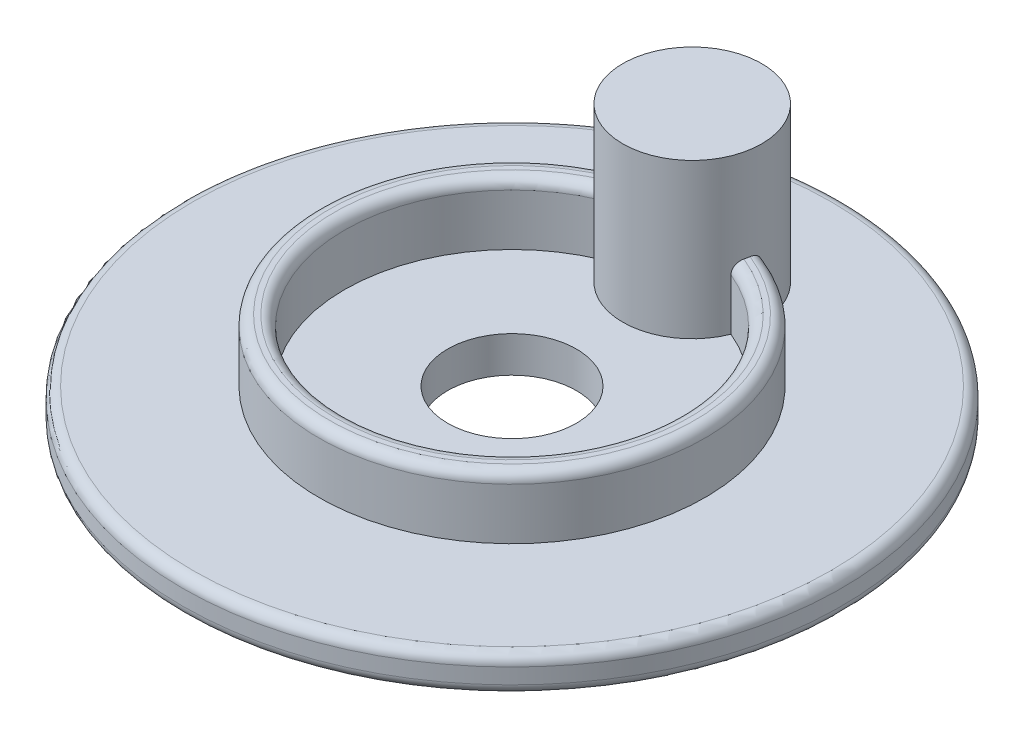
ISO-10303-21;
HEADER;
FILE_DESCRIPTION(('STEP AP214'),'2;1');
FILE_NAME('part.step','',(''),(''),'','','');
FILE_SCHEMA(('AUTOMOTIVE_DESIGN { 1 0 10303 214 1 1 1 1 }'));
ENDSEC;
DATA;
#1=APPLICATION_CONTEXT('core data for automotive mechanical design processes');
#2=APPLICATION_PROTOCOL_DEFINITION('international standard','automotive_design',2000,#1);
#3=PRODUCT_CONTEXT('',#1,'mechanical');
#4=PRODUCT('Part','Part','',(#3));
#5=PRODUCT_RELATED_PRODUCT_CATEGORY('part','',(#4));
#6=PRODUCT_DEFINITION_FORMATION('','',#4);
#7=PRODUCT_DEFINITION_CONTEXT('part definition',#1,'design');
#8=PRODUCT_DEFINITION('design','',#6,#7);
#9=PRODUCT_DEFINITION_SHAPE('','',#8);
#10=(LENGTH_UNIT() NAMED_UNIT(*) SI_UNIT(.MILLI.,.METRE.));
#11=(NAMED_UNIT(*) PLANE_ANGLE_UNIT() SI_UNIT($,.RADIAN.));
#12=(NAMED_UNIT(*) SI_UNIT($,.STERADIAN.) SOLID_ANGLE_UNIT());
#13=UNCERTAINTY_MEASURE_WITH_UNIT(LENGTH_MEASURE(1.E-05),#10,'distance_accuracy_value','');
#14=(GEOMETRIC_REPRESENTATION_CONTEXT(3) GLOBAL_UNCERTAINTY_ASSIGNED_CONTEXT((#13)) GLOBAL_UNIT_ASSIGNED_CONTEXT((#10,
#11,#12)) REPRESENTATION_CONTEXT('',''));
#15=CARTESIAN_POINT('',(0.,0.,0.));
#16=DIRECTION('',(0.,0.,1.));
#17=DIRECTION('',(1.,0.,0.));
#18=AXIS2_PLACEMENT_3D('',#15,#16,#17);
#19=CARTESIAN_POINT('',(0.,19.,0.));
#20=DIRECTION('',(0.,-1.,0.));
#21=DIRECTION('',(0.,0.,-1.));
#22=AXIS2_PLACEMENT_3D('',#19,#20,#21);
#23=CYLINDRICAL_SURFACE('',#22,37.5);
#24=DIRECTION('',(0.,-1.,0.));
#25=VECTOR('',#24,1.);
#26=CARTESIAN_POINT('',(13.4999924414189,22.,-34.9857142857143));
#27=LINE('',#26,#25);
#28=CARTESIAN_POINT('',(13.4999924414189,17.,-34.9857142857143));
#29=VERTEX_POINT('',#28);
#30=CARTESIAN_POINT('',(13.4999924414189,7.,-34.9857142857143));
#31=VERTEX_POINT('',#30);
#32=EDGE_CURVE('E205',#29,#31,#27,.T.);
#33=ORIENTED_EDGE('',*,*,#32,.F.);
#34=CARTESIAN_POINT('',(0.,17.,0.));
#35=DIRECTION('',(0.,1.,0.));
#36=DIRECTION('',(0.,0.,1.));
#37=AXIS2_PLACEMENT_3D('',#34,#35,#36);
#38=CIRCLE('',#37,37.5);
#39=CARTESIAN_POINT('',(-13.4999924414189,17.,-34.9857142857143));
#40=VERTEX_POINT('',#39);
#41=EDGE_CURVE('E159',#29,#40,#38,.F.);
#42=ORIENTED_EDGE('',*,*,#41,.T.);
#43=DIRECTION('',(0.,-1.,0.));
#44=VECTOR('',#43,1.);
#45=CARTESIAN_POINT('',(-13.4999924414189,22.,-34.9857142857143));
#46=LINE('',#45,#44);
#47=CARTESIAN_POINT('',(-13.4999924414189,7.,-34.9857142857143));
#48=VERTEX_POINT('',#47);
#49=EDGE_CURVE('E67',#48,#40,#46,.F.);
#50=ORIENTED_EDGE('',*,*,#49,.F.);
#51=CARTESIAN_POINT('',(0.,7.,0.));
#52=DIRECTION('',(0.,1.,0.));
#53=DIRECTION('',(0.,0.,1.));
#54=AXIS2_PLACEMENT_3D('',#51,#52,#53);
#55=CIRCLE('',#54,37.5);
#56=EDGE_CURVE('E126',#48,#31,#55,.T.);
#57=ORIENTED_EDGE('',*,*,#56,.T.);
#58=EDGE_LOOP('',(#33,#42,#50,#57));
#59=FACE_BOUND('',#58,.T.);
#60=ADVANCED_FACE('F45',(#59),#23,.T.);
#61=CARTESIAN_POINT('',(0.,19.,0.));
#62=DIRECTION('',(0.,-1.,0.));
#63=DIRECTION('',(0.,0.,-1.));
#64=AXIS2_PLACEMENT_3D('',#61,#62,#63);
#65=CYLINDRICAL_SURFACE('',#64,32.5);
#66=CARTESIAN_POINT('',(0.,17.,0.));
#67=DIRECTION('',(0.,1.,0.));
#68=DIRECTION('',(0.,0.,1.));
#69=AXIS2_PLACEMENT_3D('',#66,#67,#68);
#70=CIRCLE('',#69,32.5);
#71=CARTESIAN_POINT('',(-12.5342306814383,17.,-29.9857142857143));
#72=VERTEX_POINT('',#71);
#73=CARTESIAN_POINT('',(12.5342306814383,17.,-29.9857142857143));
#74=VERTEX_POINT('',#73);
#75=EDGE_CURVE('E118',#72,#74,#70,.T.);
#76=ORIENTED_EDGE('',*,*,#75,.T.);
#77=DIRECTION('',(0.,-1.,0.));
#78=VECTOR('',#77,1.);
#79=CARTESIAN_POINT('',(12.5342306814383,22.,-29.9857142857143));
#80=LINE('',#79,#78);
#81=CARTESIAN_POINT('',(12.5342306814383,7.,-29.9857142857143));
#82=VERTEX_POINT('',#81);
#83=EDGE_CURVE('E74',#74,#82,#80,.T.);
#84=ORIENTED_EDGE('',*,*,#83,.T.);
#85=CARTESIAN_POINT('',(0.,7.,0.));
#86=DIRECTION('',(0.,1.,0.));
#87=DIRECTION('',(0.,0.,1.));
#88=AXIS2_PLACEMENT_3D('',#85,#86,#87);
#89=CIRCLE('',#88,32.5);
#90=CARTESIAN_POINT('',(-12.5342306814383,7.,-29.9857142857143));
#91=VERTEX_POINT('',#90);
#92=EDGE_CURVE('E116',#82,#91,#89,.F.);
#93=ORIENTED_EDGE('',*,*,#92,.T.);
#94=DIRECTION('',(0.,-1.,0.));
#95=VECTOR('',#94,1.);
#96=CARTESIAN_POINT('',(-12.5342306814383,22.,-29.9857142857143));
#97=LINE('',#96,#95);
#98=EDGE_CURVE('E106',#91,#72,#97,.F.);
#99=ORIENTED_EDGE('',*,*,#98,.T.);
#100=EDGE_LOOP('',(#76,#84,#93,#99));
#101=FACE_BOUND('',#100,.T.);
#102=ADVANCED_FACE('F115',(#101),#65,.F.);
#103=CARTESIAN_POINT('',(0.,17.,0.));
#104=DIRECTION('',(0.,1.,0.));
#105=DIRECTION('',(0.,0.,1.));
#106=AXIS2_PLACEMENT_3D('',#103,#104,#105);
#107=TOROIDAL_SURFACE('',#106,34.5,2.);
#108=CARTESIAN_POINT('',(0.,19.,0.));
#109=DIRECTION('',(0.,1.,0.));
#110=DIRECTION('',(0.,0.,1.));
#111=AXIS2_PLACEMENT_3D('',#108,#109,#110);
#112=CIRCLE('',#111,34.5);
#113=CARTESIAN_POINT('',(13.1392541645255,19.,-31.9));
#114=VERTEX_POINT('',#113);
#115=CARTESIAN_POINT('',(-13.1392541645255,19.,-31.9));
#116=VERTEX_POINT('',#115);
#117=EDGE_CURVE('E155',#114,#116,#112,.F.);
#118=ORIENTED_EDGE('',*,*,#117,.F.);
#119=CARTESIAN_POINT('',(13.4574158289762,16.9998,-33.9285714181429));
#120=CARTESIAN_POINT('',(13.4574144173344,17.0545056757267,-33.928578843322));
#121=CARTESIAN_POINT('',(13.4572304603151,17.1091844471926,-33.9262404796411));
#122=CARTESIAN_POINT('',(13.4564838598886,17.218131998119,-33.9169142550499));
#123=CARTESIAN_POINT('',(13.4559212822476,17.2724008471276,-33.909927201617));
#124=CARTESIAN_POINT('',(13.4536498283262,17.4337539396021,-33.8821122901966));
#125=CARTESIAN_POINT('',(13.4513573831885,17.5397269979853,-33.8544301241502));
#126=CARTESIAN_POINT('',(13.4449784553747,17.7454532895092,-33.7818612507831));
#127=CARTESIAN_POINT('',(13.4408922087323,17.8452073389934,-33.7369768070862));
#128=CARTESIAN_POINT('',(13.4305739973357,18.0360152113749,-33.6316159779949));
#129=CARTESIAN_POINT('',(13.4243414211031,18.1270665454586,-33.571135150505));
#130=CARTESIAN_POINT('',(13.4091580731518,18.3002378827599,-33.434986634043));
#131=CARTESIAN_POINT('',(13.4001470188815,18.3820985500734,-33.358996233747));
#132=CARTESIAN_POINT('',(13.3790574540853,18.5324223858058,-33.195106525718));
#133=CARTESIAN_POINT('',(13.3669781511551,18.6008820851978,-33.1072041443426));
#134=CARTESIAN_POINT('',(13.3389501789862,18.7249333065295,-32.9187045171992));
#135=CARTESIAN_POINT('',(13.3228792968959,18.7799813003279,-32.8177672257079));
#136=CARTESIAN_POINT('',(13.2869546411496,18.8724741931693,-32.6087507538406));
#137=CARTESIAN_POINT('',(13.2671007797468,18.9099186838267,-32.5006714078416));
#138=CARTESIAN_POINT('',(13.2235226881637,18.9663246851704,-32.27947523551));
#139=CARTESIAN_POINT('',(13.199765923008,18.9851205740949,-32.1663224372503));
#140=CARTESIAN_POINT('',(13.148955175443,19.0029067051528,-31.9391973925251));
#141=CARTESIAN_POINT('',(13.1219014478561,19.0018984769831,-31.8252252100297));
#142=CARTESIAN_POINT('',(13.0657951446087,18.9800619834496,-31.6017579153184));
#143=CARTESIAN_POINT('',(13.0367840589503,18.9595688464566,-31.4922196959342));
#144=CARTESIAN_POINT('',(12.9774833344311,18.8996437962992,-31.2788182771367));
#145=CARTESIAN_POINT('',(12.9471938470116,18.860214120672,-31.1749544088578));
#146=CARTESIAN_POINT('',(12.8872987906026,18.7643786442,-30.9778171956945));
#147=CARTESIAN_POINT('',(12.8576912505481,18.7083130983703,-30.8843788804021));
#148=CARTESIAN_POINT('',(12.8000270425148,18.5804967058315,-30.7083925629165));
#149=CARTESIAN_POINT('',(12.7719702647317,18.5087469714537,-30.6258437890961));
#150=CARTESIAN_POINT('',(12.7190529410507,18.3520954903509,-30.4742834044056));
#151=CARTESIAN_POINT('',(12.6941733633002,18.2672794943705,-30.4051897454779));
#152=CARTESIAN_POINT('',(12.6487563939327,18.0865340347076,-30.2815985996307));
#153=CARTESIAN_POINT('',(12.6282201963043,17.9906015263017,-30.2271051251847));
#154=CARTESIAN_POINT('',(12.5926014063199,17.7900514594601,-30.133903341536));
#155=CARTESIAN_POINT('',(12.5775365423574,17.6854069950348,-30.0952462951689));
#156=CARTESIAN_POINT('',(12.5538444995709,17.4707146581686,-30.0349164781093));
#157=CARTESIAN_POINT('',(12.5452089055412,17.3606740505973,-30.0132215040611));
#158=CARTESIAN_POINT('',(12.5380973871844,17.2081290268839,-29.9953891622806));
#159=CARTESIAN_POINT('',(12.5366460719681,17.1665205228256,-29.9917556546748));
#160=CARTESIAN_POINT('',(12.534713044891,17.0832139548519,-29.9869194799736));
#161=CARTESIAN_POINT('',(12.5342296203805,17.0415161800581,-29.98571251917));
#162=CARTESIAN_POINT('',(12.5342306851531,16.9998,-29.985714295));
#163=B_SPLINE_CURVE_WITH_KNOTS('',3,(#119,#120,#121,#122,#123,#124,#125,#126,#127,#128,#129,
#130,#131,#132,#133,#134,#135,#136,#137,#138,#139,#140,#141,#142,#143,#144,#145,#146,#147,#148,
#149,#150,#151,#152,#153,#154,#155,#156,#157,#158,#159,#160,#161,#162),.UNSPECIFIED.,.F.,.F.,(4,
2,2,2,2,2,2,2,2,2,2,2,2,2,2,2,2,2,2,2,2,4),(0.,0.164013114976911,0.327997748307102,
0.654953654600703,0.98186655198686,1.30887266234879,1.64354277639147,1.97829941020852,
2.32494805147729,2.67160473428877,3.02131329684437,3.37099484753967,3.71476886214648,
4.05850226648402,4.39564011551689,4.73275406229653,5.06774310429607,5.40282411493564,
5.7389813783424,6.07469787165953,6.20001093474513,6.32510206394407),.UNSPECIFIED.);
#164=EDGE_CURVE('E121',#114,#74,#163,.T.);
#165=ORIENTED_EDGE('',*,*,#164,.T.);
#166=ORIENTED_EDGE('',*,*,#75,.F.);
#167=CARTESIAN_POINT('',(-12.5342306851531,16.9998,-29.985714295));
#168=CARTESIAN_POINT('',(-12.5342268697503,17.0560370969131,-29.9857102014814));
#169=CARTESIAN_POINT('',(-12.5351083889939,17.112247504364,-29.9879076817219));
#170=CARTESIAN_POINT('',(-12.5386171632372,17.2242670653584,-29.9966898332425));
#171=CARTESIAN_POINT('',(-12.5412443393752,17.2800762369129,-30.0032743063356));
#172=CARTESIAN_POINT('',(-12.5516963952655,17.4462179749447,-30.0295577193439));
#173=CARTESIAN_POINT('',(-12.5620919513565,17.5554391168735,-30.0557867580812));
#174=CARTESIAN_POINT('',(-12.5891352216796,17.7675921308088,-30.125059934522));
#175=CARTESIAN_POINT('',(-12.6057859806872,17.8705209115369,-30.1681122615214));
#176=CARTESIAN_POINT('',(-12.6443687816386,18.0671541834741,-30.270000660939));
#177=CARTESIAN_POINT('',(-12.6662996704453,18.1608606824676,-30.3288332873889));
#178=CARTESIAN_POINT('',(-12.71417539284,18.3362806307703,-30.4607657656329));
#179=CARTESIAN_POINT('',(-12.7401156037068,18.4180076834803,-30.533849211402));
#180=CARTESIAN_POINT('',(-12.7946190182422,18.5672854145666,-30.6924783656644));
#181=CARTESIAN_POINT('',(-12.8231825229434,18.6348344630349,-30.7780255050751));
#182=CARTESIAN_POINT('',(-12.8813541023824,18.7536392468189,-30.9589970000832));
#183=CARTESIAN_POINT('',(-12.9109582246778,18.8049505009224,-31.0543861877352));
#184=CARTESIAN_POINT('',(-12.9699017117889,18.8902257582849,-31.2526892087434));
#185=CARTESIAN_POINT('',(-12.9992410969053,18.9241911029708,-31.3556024595304));
#186=CARTESIAN_POINT('',(-13.0564582511928,18.9739983135213,-31.5662246489553));
#187=CARTESIAN_POINT('',(-13.0843345102258,18.9898217924573,-31.673938338251));
#188=CARTESIAN_POINT('',(-13.1376245140699,19.003044226538,-31.8910896393815));
#189=CARTESIAN_POINT('',(-13.1630380273819,19.0004414513077,-32.0005274121589));
#190=CARTESIAN_POINT('',(-13.2110676270142,18.9769229859204,-32.219632337999));
#191=CARTESIAN_POINT('',(-13.2336403826622,18.955755665444,-32.3292819056834));
#192=CARTESIAN_POINT('',(-13.2752139476901,18.8955084731271,-32.5442532211605));
#193=CARTESIAN_POINT('',(-13.2942142818322,18.8564262204455,-32.6495743916944));
#194=CARTESIAN_POINT('',(-13.3289403736964,18.7604541276025,-32.8551346096964));
#195=CARTESIAN_POINT('',(-13.3445886847945,18.7032063677102,-32.955219782195));
#196=CARTESIAN_POINT('',(-13.3722800261321,18.5727080043764,-33.1449178755092));
#197=CARTESIAN_POINT('',(-13.3843228762751,18.4994566018528,-33.234530273063));
#198=CARTESIAN_POINT('',(-13.4052345081904,18.33832263572,-33.4010060902396));
#199=CARTESIAN_POINT('',(-13.414083447063,18.2503534113501,-33.477788269201));
#200=CARTESIAN_POINT('',(-13.4289759312037,18.0623815166404,-33.6152952852834));
#201=CARTESIAN_POINT('',(-13.4350190162139,17.962376875458,-33.6760174873054));
#202=CARTESIAN_POINT('',(-13.4446552025307,17.7557533375156,-33.7777863466095));
#203=CARTESIAN_POINT('',(-13.4483045398741,17.6493556567674,-33.819277356271));
#204=CARTESIAN_POINT('',(-13.4537482819707,17.430997184884,-33.8829946601765));
#205=CARTESIAN_POINT('',(-13.455546165058,17.3190472412716,-33.9052570665295));
#206=CARTESIAN_POINT('',(-13.456824590558,17.1718751733412,-33.9211695182661));
#207=CARTESIAN_POINT('',(-13.4570470543442,17.1374912362917,-33.9239491880648));
#208=CARTESIAN_POINT('',(-13.4573426123094,17.0686765089656,-33.9276493397925));
#209=CARTESIAN_POINT('',(-13.4574159386702,17.0342458751527,-33.9285727116391));
#210=CARTESIAN_POINT('',(-13.4574158289763,16.9998,-33.9285714181432));
#211=B_SPLINE_CURVE_WITH_KNOTS('',3,(#167,#168,#169,#170,#171,#172,#173,#174,#175,#176,#177,
#178,#179,#180,#181,#182,#183,#184,#185,#186,#187,#188,#189,#190,#191,#192,#193,#194,#195,#196,
#197,#198,#199,#200,#201,#202,#203,#204,#205,#206,#207,#208,#209,#210),.UNSPECIFIED.,.F.,.F.,(4,
2,2,2,2,2,2,2,2,2,2,2,2,2,2,2,2,2,2,2,2,4),(0.,0.168607732966097,0.337207849425625,
0.673891678436985,1.01073960408894,1.34751403154103,1.68390301780707,2.02033065430595,
2.35559525892231,2.6908339322903,3.02641207326334,3.36202172817174,3.70225190011525,
4.04252730075171,4.3899736564934,4.73743736463633,5.08702405062106,5.43666806077358,
5.77777195553727,6.11823384149522,6.221689479048,6.32498392991242),.UNSPECIFIED.);
#212=EDGE_CURVE('E180',#72,#116,#211,.T.);
#213=ORIENTED_EDGE('',*,*,#212,.T.);
#214=EDGE_LOOP('',(#118,#165,#166,#213));
#215=FACE_BOUND('',#214,.T.);
#216=ADVANCED_FACE('F192',(#215),#107,.T.);
#217=CARTESIAN_POINT('',(0.,17.,0.));
#218=DIRECTION('',(0.,1.,0.));
#219=DIRECTION('',(0.,0.,1.));
#220=AXIS2_PLACEMENT_3D('',#217,#218,#219);
#221=TOROIDAL_SURFACE('',#220,35.5,2.);
#222=ORIENTED_EDGE('',*,*,#41,.F.);
#223=CARTESIAN_POINT('',(13.4999924414076,16.9998,-34.985714275));
#224=CARTESIAN_POINT('',(13.4999899547307,17.0536329745252,-34.9857287238921));
#225=CARTESIAN_POINT('',(13.4999899276816,17.1074619317858,-34.9833972496276));
#226=CARTESIAN_POINT('',(13.4999766332635,17.2147073111454,-34.9741090601479));
#227=CARTESIAN_POINT('',(13.4999633689337,17.2681238250999,-34.9671534067124));
#228=CARTESIAN_POINT('',(13.499905538721,17.3740132564129,-34.9487098217433));
#229=CARTESIAN_POINT('',(13.4998610624664,17.4264884354747,-34.937234909009));
#230=CARTESIAN_POINT('',(13.4997061356343,17.5302664603213,-34.909888940599));
#231=CARTESIAN_POINT('',(13.4995956834144,17.5815692768869,-34.8940177754833));
#232=CARTESIAN_POINT('',(13.4991009478815,17.7331455080814,-34.8400511133429));
#233=CARTESIAN_POINT('',(13.4985534243507,17.8312261073027,-34.7955777571894));
#234=CARTESIAN_POINT('',(13.496571460751,18.018849826176,-34.6913604325385));
#235=CARTESIAN_POINT('',(13.495136596677,18.1083888407102,-34.631609171687));
#236=CARTESIAN_POINT('',(13.4907851678145,18.2798138791902,-34.4965933977191));
#237=CARTESIAN_POINT('',(13.487820341785,18.361340728843,-34.4208742995195));
#238=CARTESIAN_POINT('',(13.4798195699396,18.5114209090165,-34.2576123285346));
#239=CARTESIAN_POINT('',(13.4747829919531,18.5799702702788,-34.1700658522452));
#240=CARTESIAN_POINT('',(13.461787763825,18.7061809248193,-33.9802904275848));
#241=CARTESIAN_POINT('',(13.4536786481031,18.7629967187266,-33.8775084744869));
#242=CARTESIAN_POINT('',(13.434191708356,18.8591602094536,-33.664356522181));
#243=CARTESIAN_POINT('',(13.4228134558381,18.8985056146712,-33.5539855297053));
#244=CARTESIAN_POINT('',(13.3963056625503,18.9593530414738,-33.3259413135855));
#245=CARTESIAN_POINT('',(13.3810921218905,18.980400937157,-33.2081560858591));
#246=CARTESIAN_POINT('',(13.347220150079,19.0021669054666,-32.971199584585));
#247=CARTESIAN_POINT('',(13.3285619207529,19.0028861687747,-32.8520283926245));
#248=CARTESIAN_POINT('',(13.2886712580937,18.9837814867689,-32.6177506991559));
#249=CARTESIAN_POINT('',(13.2674849557477,18.9642871303243,-32.5026096575149));
#250=CARTESIAN_POINT('',(13.2232074306106,18.9054833668645,-32.2778868322746));
#251=CARTESIAN_POINT('',(13.2001165658804,18.8661776773439,-32.1683040099483));
#252=CARTESIAN_POINT('',(13.1539706322896,18.7701503779794,-31.9612532947442));
#253=CARTESIAN_POINT('',(13.1309357892816,18.7139941660639,-31.8635184821903));
#254=CARTESIAN_POINT('',(13.0855537030355,18.5853813846498,-31.6792624018784));
#255=CARTESIAN_POINT('',(13.0632063616116,18.5129271551624,-31.5927395271582));
#256=CARTESIAN_POINT('',(13.021011075757,18.3553202712599,-31.4349149209358));
#257=CARTESIAN_POINT('',(13.001123090462,18.2704408857248,-31.3633507303774));
#258=CARTESIAN_POINT('',(12.9646110233555,18.0893501575886,-31.2352539998953));
#259=CARTESIAN_POINT('',(12.9479876844063,17.993136243793,-31.1787248801307));
#260=CARTESIAN_POINT('',(12.9191651259513,17.7926024562649,-31.0823859589683));
#261=CARTESIAN_POINT('',(12.9069472904254,17.688319007875,-31.0425056901417));
#262=CARTESIAN_POINT('',(12.8876599780105,17.4742977638884,-30.9801366129713));
#263=CARTESIAN_POINT('',(12.8805838414646,17.3645672211266,-30.9576253055681));
#264=CARTESIAN_POINT('',(12.8746783416316,17.2116227676772,-30.9388825083058));
#265=CARTESIAN_POINT('',(12.8734558295233,17.1693203162385,-30.9350102083425));
#266=CARTESIAN_POINT('',(12.871827208792,17.0846180119705,-30.9298560310052));
#267=CARTESIAN_POINT('',(12.8714196463463,17.0422184679216,-30.9285695406765));
#268=CARTESIAN_POINT('',(12.8714206467543,16.9998,-30.9285714381429));
#269=B_SPLINE_CURVE_WITH_KNOTS('',3,(#223,#224,#225,#226,#227,#228,#229,#230,#231,#232,#233,
#234,#235,#236,#237,#238,#239,#240,#241,#242,#243,#244,#245,#246,#247,#248,#249,#250,#251,#252,
#253,#254,#255,#256,#257,#258,#259,#260,#261,#262,#263,#264,#265,#266,#267,#268),.UNSPECIFIED.,
.F.,.F.,(4,2,2,2,2,2,2,2,2,2,2,2,2,2,2,2,2,2,2,2,2,2,4),(0.,0.161440946562061,0.322844836699355,
0.4837871262088,0.644733422571578,0.966206653779078,1.28783361596148,1.62028953473868,
1.95284697385498,2.30439862484178,2.65599637547557,3.01608986065854,3.37616225452467,
3.73045450987586,4.08468030884758,4.4281442754682,4.77155896019543,5.10831913809362,
5.44515585638527,5.78055206976081,6.11551309145407,6.24293635038863,6.37013209013873),.UNSPECIFIED.);
#270=CARTESIAN_POINT('',(13.3356664625358,19.0000000000003,-32.9));
#271=VERTEX_POINT('',#270);
#272=EDGE_CURVE('E11',#29,#271,#269,.T.);
#273=ORIENTED_EDGE('',*,*,#272,.T.);
#274=CARTESIAN_POINT('',(0.,19.,0.));
#275=DIRECTION('',(0.,1.,0.));
#276=DIRECTION('',(0.,0.,1.));
#277=AXIS2_PLACEMENT_3D('',#274,#275,#276);
#278=CIRCLE('',#277,35.5);
#279=CARTESIAN_POINT('',(-13.3356664625357,19.,-32.9));
#280=VERTEX_POINT('',#279);
#281=EDGE_CURVE('E151',#280,#271,#278,.T.);
#282=ORIENTED_EDGE('',*,*,#281,.F.);
#283=CARTESIAN_POINT('',(-12.8714206467543,16.9998,-30.9285714381429));
#284=CARTESIAN_POINT('',(-12.8714171743057,17.0558214967457,-30.9285671117731));
#285=CARTESIAN_POINT('',(-12.8721305543787,17.1118164220704,-30.9308149912982));
#286=CARTESIAN_POINT('',(-12.8749675988924,17.2234066950352,-30.939797781384));
#287=CARTESIAN_POINT('',(-12.8770912019435,17.2790020599623,-30.9465324966247));
#288=CARTESIAN_POINT('',(-12.8855335680313,17.4445051202344,-30.9734132797008));
#289=CARTESIAN_POINT('',(-12.8939240290957,17.5533057994145,-31.000236100277));
#290=CARTESIAN_POINT('',(-12.915676852192,17.7646422109985,-31.0710501117122));
#291=CARTESIAN_POINT('',(-12.9290416876298,17.8671747971435,-31.1150498439719));
#292=CARTESIAN_POINT('',(-12.959854702327,18.0630504522336,-31.2191140166693));
#293=CARTESIAN_POINT('',(-12.9773019302378,18.15639565499,-31.2791747147731));
#294=CARTESIAN_POINT('',(-13.0151360624063,18.3311882433863,-31.4137624534301));
#295=CARTESIAN_POINT('',(-13.0355205469729,18.4126453122822,-31.4882776038329));
#296=CARTESIAN_POINT('',(-13.0779722963667,18.5615029336063,-31.6498355186865));
#297=CARTESIAN_POINT('',(-13.1000397844668,18.6289016165566,-31.7368799466774));
#298=CARTESIAN_POINT('',(-13.1445807006417,18.7478921928802,-31.9212042880693));
#299=CARTESIAN_POINT('',(-13.1670545135254,18.7994681707984,-32.0184943759557));
#300=CARTESIAN_POINT('',(-13.211179960333,18.885468921686,-32.2205381664594));
#301=CARTESIAN_POINT('',(-13.2328316150369,18.919894128406,-32.3252916802467));
#302=CARTESIAN_POINT('',(-13.2745470953848,18.9712112273075,-32.5406187903204));
#303=CARTESIAN_POINT('',(-13.2945898754688,18.9878976183008,-32.6512453363155));
#304=CARTESIAN_POINT('',(-13.3320530902172,19.0028958857205,-32.8741726296029));
#305=CARTESIAN_POINT('',(-13.3494731052434,19.0012048249452,-32.9864736416547));
#306=CARTESIAN_POINT('',(-13.3816651815677,18.9794955424646,-33.2127034841558));
#307=CARTESIAN_POINT('',(-13.3963558738581,18.958998131587,-33.3265978338997));
#308=CARTESIAN_POINT('',(-13.4223692004177,18.899758718818,-33.5499448835898));
#309=CARTESIAN_POINT('',(-13.4336912048825,18.8610133088033,-33.6593967496773));
#310=CARTESIAN_POINT('',(-13.4533917435719,18.7650132139934,-33.8738686714077));
#311=CARTESIAN_POINT('',(-13.4616792875389,18.7072720320959,-33.9786797210964));
#312=CARTESIAN_POINT('',(-13.475283663668,18.5750700140086,-34.1774040742907));
#313=CARTESIAN_POINT('',(-13.4806003214898,18.5006081969627,-34.2713167379911));
#314=CARTESIAN_POINT('',(-13.4888780917181,18.3367250126292,-34.4452370704666));
#315=CARTESIAN_POINT('',(-13.4918386052043,18.2472998487193,-34.5252411997241));
#316=CARTESIAN_POINT('',(-13.496116703207,18.0557244362214,-34.6683666663511));
#317=CARTESIAN_POINT('',(-13.4974342192464,17.953573657449,-34.7314872999624));
#318=CARTESIAN_POINT('',(-13.4990980244909,17.7441677065437,-34.8357875529394));
#319=CARTESIAN_POINT('',(-13.4994841426285,17.6373290739777,-34.8778035801506));
#320=CARTESIAN_POINT('',(-13.4999141032593,17.4179477808811,-34.9419348001987));
#321=CARTESIAN_POINT('',(-13.4999586782838,17.3054178493464,-34.9640924943322));
#322=CARTESIAN_POINT('',(-13.4999838832169,17.1600431580398,-34.9791222671939));
#323=CARTESIAN_POINT('',(-13.4999874462015,17.1280198678336,-34.9815978651276));
#324=CARTESIAN_POINT('',(-13.4999917604785,17.0639357203313,-34.9848931565138));
#325=CARTESIAN_POINT('',(-13.4999925159285,17.0318749889722,-34.9857152976958));
#326=CARTESIAN_POINT('',(-13.4999924414076,16.9998,-34.9857142750002));
#327=B_SPLINE_CURVE_WITH_KNOTS('',3,(#283,#284,#285,#286,#287,#288,#289,#290,#291,#292,#293,
#294,#295,#296,#297,#298,#299,#300,#301,#302,#303,#304,#305,#306,#307,#308,#309,#310,#311,#312,
#313,#314,#315,#316,#317,#318,#319,#320,#321,#322,#323,#324,#325,#326),.UNSPECIFIED.,.F.,.F.,(4,
2,2,2,2,2,2,2,2,2,2,2,2,2,2,2,2,2,2,2,2,4),(0.,0.167961358496068,0.33591540581312,
0.671302160853763,1.00685590337051,1.34233152719845,1.67753235204671,2.01277772337907,
2.34835920790121,2.68393220498634,3.02335175297076,3.36282554995191,3.71119688037144,
4.05963330086135,4.41779638691247,4.7759804888081,5.13425561028377,5.49254566348779,
5.83521929617429,6.17715776665774,6.27348617197007,6.36967187022839),.UNSPECIFIED.);
#328=EDGE_CURVE('E60',#280,#40,#327,.T.);
#329=ORIENTED_EDGE('',*,*,#328,.T.);
#330=EDGE_LOOP('',(#222,#273,#282,#329));
#331=FACE_BOUND('',#330,.T.);
#332=ADVANCED_FACE('F47',(#331),#221,.T.);
#333=CARTESIAN_POINT('',(0.,7.,0.));
#334=DIRECTION('',(0.,-1.,0.));
#335=DIRECTION('',(0.,0.,-1.));
#336=AXIS2_PLACEMENT_3D('',#333,#334,#335);
#337=CYLINDRICAL_SURFACE('',#336,64.);
#338=CARTESIAN_POINT('',(0.,2.,0.));
#339=DIRECTION('',(0.,1.,0.));
#340=DIRECTION('',(0.,0.,1.));
#341=AXIS2_PLACEMENT_3D('',#338,#339,#340);
#342=CIRCLE('',#341,64.);
#343=CARTESIAN_POINT('',(0.,2.,64.));
#344=VERTEX_POINT('',#343);
#345=EDGE_CURVE('E131',#344,#344,#342,.T.);
#346=ORIENTED_EDGE('',*,*,#345,.T.);
#347=EDGE_LOOP('',(#346));
#348=FACE_BOUND('',#347,.T.);
#349=CARTESIAN_POINT('',(0.,5.,0.));
#350=DIRECTION('',(0.,1.,0.));
#351=DIRECTION('',(0.,0.,1.));
#352=AXIS2_PLACEMENT_3D('',#349,#350,#351);
#353=CIRCLE('',#352,64.);
#354=CARTESIAN_POINT('',(0.,5.,64.));
#355=VERTEX_POINT('',#354);
#356=EDGE_CURVE('E125',#355,#355,#353,.F.);
#357=ORIENTED_EDGE('',*,*,#356,.T.);
#358=EDGE_LOOP('',(#357));
#359=FACE_BOUND('',#358,.T.);
#360=ADVANCED_FACE('F230',(#348,#359),#337,.T.);
#361=CARTESIAN_POINT('',(0.,7.,0.));
#362=DIRECTION('',(0.,1.,0.));
#363=DIRECTION('',(0.,0.,1.));
#364=AXIS2_PLACEMENT_3D('',#361,#362,#363);
#365=PLANE('',#364);
#366=CARTESIAN_POINT('',(0.,7.,0.));
#367=DIRECTION('',(0.,1.,0.));
#368=DIRECTION('',(0.,0.,1.));
#369=AXIS2_PLACEMENT_3D('',#366,#367,#368);
#370=CIRCLE('',#369,62.);
#371=CARTESIAN_POINT('',(0.,7.,62.));
#372=VERTEX_POINT('',#371);
#373=EDGE_CURVE('E145',#372,#372,#370,.T.);
#374=ORIENTED_EDGE('',*,*,#373,.T.);
#375=EDGE_LOOP('',(#374));
#376=FACE_BOUND('',#375,.T.);
#377=ORIENTED_EDGE('',*,*,#56,.F.);
#378=CARTESIAN_POINT('',(0.,7.,-35.));
#379=DIRECTION('',(0.,1.,0.));
#380=DIRECTION('',(0.,0.,1.));
#381=AXIS2_PLACEMENT_3D('',#378,#379,#380);
#382=CIRCLE('',#381,13.5);
#383=EDGE_CURVE('E111',#31,#48,#382,.T.);
#384=ORIENTED_EDGE('',*,*,#383,.F.);
#385=EDGE_LOOP('',(#377,#384));
#386=FACE_BOUND('',#385,.T.);
#387=ADVANCED_FACE('F217',(#376,#386),#365,.T.);
#388=CARTESIAN_POINT('',(0.,0.,0.));
#389=DIRECTION('',(0.,1.,0.));
#390=DIRECTION('',(0.,0.,1.));
#391=AXIS2_PLACEMENT_3D('',#388,#389,#390);
#392=PLANE('',#391);
#393=CARTESIAN_POINT('',(0.,0.,0.));
#394=DIRECTION('',(0.,1.,0.));
#395=DIRECTION('',(0.,0.,1.));
#396=AXIS2_PLACEMENT_3D('',#393,#394,#395);
#397=CIRCLE('',#396,62.);
#398=CARTESIAN_POINT('',(0.,0.,62.));
#399=VERTEX_POINT('',#398);
#400=EDGE_CURVE('E141',#399,#399,#397,.F.);
#401=ORIENTED_EDGE('',*,*,#400,.T.);
#402=EDGE_LOOP('',(#401));
#403=FACE_BOUND('',#402,.T.);
#404=CARTESIAN_POINT('',(0.,0.,0.));
#405=DIRECTION('',(0.,1.,0.));
#406=DIRECTION('',(0.,0.,1.));
#407=AXIS2_PLACEMENT_3D('',#404,#405,#406);
#408=CIRCLE('',#407,12.5);
#409=CARTESIAN_POINT('',(0.,0.,12.5));
#410=VERTEX_POINT('',#409);
#411=EDGE_CURVE('E134',#410,#410,#408,.T.);
#412=ORIENTED_EDGE('',*,*,#411,.T.);
#413=EDGE_LOOP('',(#412));
#414=FACE_BOUND('',#413,.T.);
#415=ADVANCED_FACE('F224',(#403,#414),#392,.F.);
#416=CARTESIAN_POINT('',(0.,19.,0.));
#417=DIRECTION('',(0.,1.,0.));
#418=DIRECTION('',(0.,0.,1.));
#419=AXIS2_PLACEMENT_3D('',#416,#417,#418);
#420=PLANE('',#419);
#421=ORIENTED_EDGE('',*,*,#117,.T.);
#422=CARTESIAN_POINT('',(0.,19.,-35.));
#423=DIRECTION('',(0.,1.,0.));
#424=DIRECTION('',(0.,0.,1.));
#425=AXIS2_PLACEMENT_3D('',#422,#423,#424);
#426=CIRCLE('',#425,13.5);
#427=EDGE_CURVE('E189',#116,#280,#426,.F.);
#428=ORIENTED_EDGE('',*,*,#427,.T.);
#429=ORIENTED_EDGE('',*,*,#281,.T.);
#430=EDGE_CURVE('E204',#271,#114,#426,.F.);
#431=ORIENTED_EDGE('',*,*,#430,.T.);
#432=EDGE_LOOP('',(#421,#428,#429,#431));
#433=FACE_BOUND('',#432,.T.);
#434=ADVANCED_FACE('F215',(#433),#420,.T.);
#435=CARTESIAN_POINT('',(0.,7.,0.));
#436=DIRECTION('',(0.,1.,0.));
#437=DIRECTION('',(0.,0.,1.));
#438=AXIS2_PLACEMENT_3D('',#435,#436,#437);
#439=CIRCLE('',#438,12.5);
#440=CARTESIAN_POINT('',(0.,7.,12.5));
#441=VERTEX_POINT('',#440);
#442=EDGE_CURVE('E120',#441,#441,#439,.T.);
#443=ORIENTED_EDGE('',*,*,#442,.F.);
#444=EDGE_LOOP('',(#443));
#445=FACE_BOUND('',#444,.T.);
#446=ORIENTED_EDGE('',*,*,#92,.F.);
#447=EDGE_CURVE('E102',#91,#82,#382,.T.);
#448=ORIENTED_EDGE('',*,*,#447,.F.);
#449=EDGE_LOOP('',(#446,#448));
#450=FACE_BOUND('',#449,.T.);
#451=ADVANCED_FACE('F123',(#445,#450),#365,.T.);
#452=CARTESIAN_POINT('',(0.,0.,0.));
#453=DIRECTION('',(0.,1.,0.));
#454=DIRECTION('',(0.,0.,1.));
#455=AXIS2_PLACEMENT_3D('',#452,#453,#454);
#456=CYLINDRICAL_SURFACE('',#455,12.5);
#457=ORIENTED_EDGE('',*,*,#411,.F.);
#458=EDGE_LOOP('',(#457));
#459=FACE_BOUND('',#458,.T.);
#460=ORIENTED_EDGE('',*,*,#442,.T.);
#461=EDGE_LOOP('',(#460));
#462=FACE_BOUND('',#461,.T.);
#463=ADVANCED_FACE('F173',(#459,#462),#456,.F.);
#464=CARTESIAN_POINT('',(0.,2.,0.));
#465=DIRECTION('',(0.,1.,0.));
#466=DIRECTION('',(0.,0.,1.));
#467=AXIS2_PLACEMENT_3D('',#464,#465,#466);
#468=TOROIDAL_SURFACE('',#467,62.,2.);
#469=ORIENTED_EDGE('',*,*,#400,.F.);
#470=EDGE_LOOP('',(#469));
#471=FACE_BOUND('',#470,.T.);
#472=ORIENTED_EDGE('',*,*,#345,.F.);
#473=EDGE_LOOP('',(#472));
#474=FACE_BOUND('',#473,.T.);
#475=ADVANCED_FACE('F222',(#471,#474),#468,.T.);
#476=CARTESIAN_POINT('',(0.,5.,0.));
#477=DIRECTION('',(0.,1.,0.));
#478=DIRECTION('',(0.,0.,1.));
#479=AXIS2_PLACEMENT_3D('',#476,#477,#478);
#480=TOROIDAL_SURFACE('',#479,62.,2.);
#481=ORIENTED_EDGE('',*,*,#356,.F.);
#482=EDGE_LOOP('',(#481));
#483=FACE_BOUND('',#482,.T.);
#484=ORIENTED_EDGE('',*,*,#373,.F.);
#485=EDGE_LOOP('',(#484));
#486=FACE_BOUND('',#485,.T.);
#487=ADVANCED_FACE('F172',(#483,#486),#480,.T.);
#488=CARTESIAN_POINT('',(0.,37.,-35.));
#489=DIRECTION('',(0.,-1.,0.));
#490=DIRECTION('',(0.,0.,-1.));
#491=AXIS2_PLACEMENT_3D('',#488,#489,#490);
#492=CYLINDRICAL_SURFACE('',#491,13.5);
#493=ORIENTED_EDGE('',*,*,#83,.F.);
#494=ORIENTED_EDGE('',*,*,#164,.F.);
#495=ORIENTED_EDGE('',*,*,#430,.F.);
#496=ORIENTED_EDGE('',*,*,#272,.F.);
#497=ORIENTED_EDGE('',*,*,#32,.T.);
#498=ORIENTED_EDGE('',*,*,#383,.T.);
#499=ORIENTED_EDGE('',*,*,#49,.T.);
#500=ORIENTED_EDGE('',*,*,#328,.F.);
#501=ORIENTED_EDGE('',*,*,#427,.F.);
#502=ORIENTED_EDGE('',*,*,#212,.F.);
#503=ORIENTED_EDGE('',*,*,#98,.F.);
#504=ORIENTED_EDGE('',*,*,#447,.T.);
#505=EDGE_LOOP('',(#493,#494,#495,#496,#497,#498,#499,#500,#501,#502,#503,#504));
#506=FACE_BOUND('',#505,.T.);
#507=CARTESIAN_POINT('',(0.,37.,-35.));
#508=DIRECTION('',(0.,1.,0.));
#509=DIRECTION('',(0.,0.,1.));
#510=AXIS2_PLACEMENT_3D('',#507,#508,#509);
#511=CIRCLE('',#510,13.5);
#512=CARTESIAN_POINT('',(0.,37.,-21.5));
#513=VERTEX_POINT('',#512);
#514=EDGE_CURVE('E250',#513,#513,#511,.T.);
#515=ORIENTED_EDGE('',*,*,#514,.F.);
#516=EDGE_LOOP('',(#515));
#517=FACE_BOUND('',#516,.T.);
#518=ADVANCED_FACE('F103',(#506,#517),#492,.T.);
#519=CARTESIAN_POINT('',(0.,37.,-35.));
#520=DIRECTION('',(0.,1.,0.));
#521=DIRECTION('',(0.,0.,1.));
#522=AXIS2_PLACEMENT_3D('',#519,#520,#521);
#523=PLANE('',#522);
#524=ORIENTED_EDGE('',*,*,#514,.T.);
#525=EDGE_LOOP('',(#524));
#526=FACE_BOUND('',#525,.T.);
#527=ADVANCED_FACE('F171',(#526),#523,.T.);
#528=CLOSED_SHELL('',(#60,#102,#216,#332,#360,#387,#415,#434,#451,#463,#475,#487,#518,#527));
#529=MANIFOLD_SOLID_BREP('B2',#528);
#530=ADVANCED_BREP_SHAPE_REPRESENTATION('',(#18,#529),#14);
#531=SHAPE_DEFINITION_REPRESENTATION(#9,#530);
ENDSEC;
END-ISO-10303-21;
